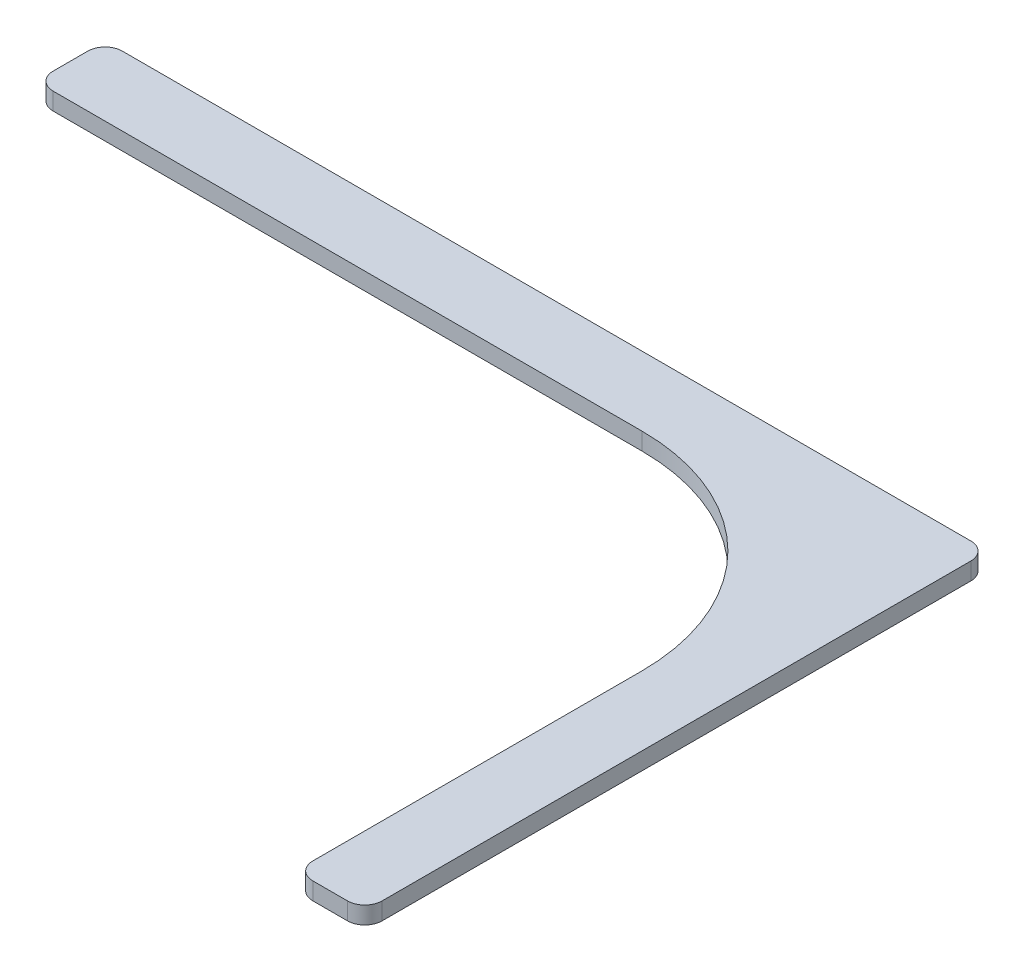
ISO-10303-21;
HEADER;
FILE_DESCRIPTION(('STEP AP214'),'2;1');
FILE_NAME('part.step','',(''),(''),'','','');
FILE_SCHEMA(('AUTOMOTIVE_DESIGN { 1 0 10303 214 1 1 1 1 }'));
ENDSEC;
DATA;
#1=APPLICATION_CONTEXT('core data for automotive mechanical design processes');
#2=APPLICATION_PROTOCOL_DEFINITION('international standard','automotive_design',2000,#1);
#3=PRODUCT_CONTEXT('',#1,'mechanical');
#4=PRODUCT('Part','Part','',(#3));
#5=PRODUCT_RELATED_PRODUCT_CATEGORY('part','',(#4));
#6=PRODUCT_DEFINITION_FORMATION('','',#4);
#7=PRODUCT_DEFINITION_CONTEXT('part definition',#1,'design');
#8=PRODUCT_DEFINITION('design','',#6,#7);
#9=PRODUCT_DEFINITION_SHAPE('','',#8);
#10=(LENGTH_UNIT() NAMED_UNIT(*) SI_UNIT(.MILLI.,.METRE.));
#11=(NAMED_UNIT(*) PLANE_ANGLE_UNIT() SI_UNIT($,.RADIAN.));
#12=(NAMED_UNIT(*) SI_UNIT($,.STERADIAN.) SOLID_ANGLE_UNIT());
#13=UNCERTAINTY_MEASURE_WITH_UNIT(LENGTH_MEASURE(1.E-05),#10,'distance_accuracy_value','');
#14=(GEOMETRIC_REPRESENTATION_CONTEXT(3) GLOBAL_UNCERTAINTY_ASSIGNED_CONTEXT((#13)) GLOBAL_UNIT_ASSIGNED_CONTEXT((#10,
#11,#12)) REPRESENTATION_CONTEXT('',''));
#15=CARTESIAN_POINT('',(0.,0.,0.));
#16=DIRECTION('',(0.,0.,1.));
#17=DIRECTION('',(1.,0.,0.));
#18=AXIS2_PLACEMENT_3D('',#15,#16,#17);
#19=CARTESIAN_POINT('',(-25.4,6.35,0.));
#20=DIRECTION('',(0.,0.,-1.));
#21=DIRECTION('',(-1.,0.,0.));
#22=AXIS2_PLACEMENT_3D('',#19,#20,#21);
#23=PLANE('',#22);
#24=DIRECTION('',(1.,0.,0.));
#25=VECTOR('',#24,1.);
#26=CARTESIAN_POINT('',(-25.4,6.35,0.));
#27=LINE('',#26,#25);
#28=CARTESIAN_POINT('',(-19.05,6.35,0.));
#29=VERTEX_POINT('',#28);
#30=CARTESIAN_POINT('',(-6.35,6.35,0.));
#31=VERTEX_POINT('',#30);
#32=EDGE_CURVE('E139',#29,#31,#27,.T.);
#33=ORIENTED_EDGE('',*,*,#32,.F.);
#34=DIRECTION('',(0.,-1.,0.));
#35=VECTOR('',#34,1.);
#36=CARTESIAN_POINT('',(-19.05,6.35,0.));
#37=LINE('',#36,#35);
#38=CARTESIAN_POINT('',(-19.05,0.,0.));
#39=VERTEX_POINT('',#38);
#40=EDGE_CURVE('E127',#29,#39,#37,.T.);
#41=ORIENTED_EDGE('',*,*,#40,.T.);
#42=DIRECTION('',(1.,0.,0.));
#43=VECTOR('',#42,1.);
#44=CARTESIAN_POINT('',(-25.4,0.,0.));
#45=LINE('',#44,#43);
#46=CARTESIAN_POINT('',(-6.35,0.,0.));
#47=VERTEX_POINT('',#46);
#48=EDGE_CURVE('E136',#39,#47,#45,.T.);
#49=ORIENTED_EDGE('',*,*,#48,.T.);
#50=DIRECTION('',(0.,-1.,0.));
#51=VECTOR('',#50,1.);
#52=CARTESIAN_POINT('',(-6.35,6.35,0.));
#53=LINE('',#52,#51);
#54=EDGE_CURVE('E141',#47,#31,#53,.F.);
#55=ORIENTED_EDGE('',*,*,#54,.T.);
#56=EDGE_LOOP('',(#33,#41,#49,#55));
#57=FACE_BOUND('',#56,.T.);
#58=ADVANCED_FACE('F33',(#57),#23,.F.);
#59=CARTESIAN_POINT('',(0.,6.35,0.));
#60=DIRECTION('',(-1.,0.,0.));
#61=DIRECTION('',(0.,0.,1.));
#62=AXIS2_PLACEMENT_3D('',#59,#60,#61);
#63=PLANE('',#62);
#64=DIRECTION('',(0.,0.,-1.));
#65=VECTOR('',#64,1.);
#66=CARTESIAN_POINT('',(0.,6.35,0.));
#67=LINE('',#66,#65);
#68=CARTESIAN_POINT('',(0.,6.35,-6.35));
#69=VERTEX_POINT('',#68);
#70=CARTESIAN_POINT('',(0.,6.35,-222.25));
#71=VERTEX_POINT('',#70);
#72=EDGE_CURVE('E220',#69,#71,#67,.T.);
#73=ORIENTED_EDGE('',*,*,#72,.F.);
#74=DIRECTION('',(0.,-1.,0.));
#75=VECTOR('',#74,1.);
#76=CARTESIAN_POINT('',(0.,6.35,-6.35));
#77=LINE('',#76,#75);
#78=CARTESIAN_POINT('',(0.,0.,-6.35));
#79=VERTEX_POINT('',#78);
#80=EDGE_CURVE('E196',#69,#79,#77,.T.);
#81=ORIENTED_EDGE('',*,*,#80,.T.);
#82=DIRECTION('',(0.,0.,-1.));
#83=VECTOR('',#82,1.);
#84=CARTESIAN_POINT('',(0.,0.,0.));
#85=LINE('',#84,#83);
#86=CARTESIAN_POINT('',(0.,0.,-222.25));
#87=VERTEX_POINT('',#86);
#88=EDGE_CURVE('E146',#79,#87,#85,.T.);
#89=ORIENTED_EDGE('',*,*,#88,.T.);
#90=DIRECTION('',(0.,-1.,0.));
#91=VECTOR('',#90,1.);
#92=CARTESIAN_POINT('',(0.,6.35,-222.25));
#93=LINE('',#92,#91);
#94=EDGE_CURVE('E194',#87,#71,#93,.F.);
#95=ORIENTED_EDGE('',*,*,#94,.T.);
#96=EDGE_LOOP('',(#73,#81,#89,#95));
#97=FACE_BOUND('',#96,.T.);
#98=ADVANCED_FACE('F229',(#97),#63,.F.);
#99=CARTESIAN_POINT('',(0.,6.35,-228.6));
#100=DIRECTION('',(0.,0.,1.));
#101=DIRECTION('',(1.,0.,0.));
#102=AXIS2_PLACEMENT_3D('',#99,#100,#101);
#103=PLANE('',#102);
#104=DIRECTION('',(-1.,0.,0.));
#105=VECTOR('',#104,1.);
#106=CARTESIAN_POINT('',(0.,0.,-228.6));
#107=LINE('',#106,#105);
#108=CARTESIAN_POINT('',(-6.35,0.,-228.6));
#109=VERTEX_POINT('',#108);
#110=CARTESIAN_POINT('',(-317.5,0.,-228.6));
#111=VERTEX_POINT('',#110);
#112=EDGE_CURVE('E149',#109,#111,#107,.T.);
#113=ORIENTED_EDGE('',*,*,#112,.T.);
#114=DIRECTION('',(0.,-1.,0.));
#115=VECTOR('',#114,1.);
#116=CARTESIAN_POINT('',(-317.5,6.35,-228.6));
#117=LINE('',#116,#115);
#118=CARTESIAN_POINT('',(-317.5,6.35,-228.6));
#119=VERTEX_POINT('',#118);
#120=EDGE_CURVE('E189',#111,#119,#117,.F.);
#121=ORIENTED_EDGE('',*,*,#120,.T.);
#122=DIRECTION('',(-1.,0.,0.));
#123=VECTOR('',#122,1.);
#124=CARTESIAN_POINT('',(0.,6.35,-228.6));
#125=LINE('',#124,#123);
#126=CARTESIAN_POINT('',(-6.35,6.35,-228.6));
#127=VERTEX_POINT('',#126);
#128=EDGE_CURVE('E215',#127,#119,#125,.T.);
#129=ORIENTED_EDGE('',*,*,#128,.F.);
#130=DIRECTION('',(0.,-1.,0.));
#131=VECTOR('',#130,1.);
#132=CARTESIAN_POINT('',(-6.35,6.35,-228.6));
#133=LINE('',#132,#131);
#134=EDGE_CURVE('E186',#127,#109,#133,.T.);
#135=ORIENTED_EDGE('',*,*,#134,.T.);
#136=EDGE_LOOP('',(#113,#121,#129,#135));
#137=FACE_BOUND('',#136,.T.);
#138=ADVANCED_FACE('F238',(#137),#103,.F.);
#139=CARTESIAN_POINT('',(-323.85,6.35,-228.6));
#140=DIRECTION('',(1.,0.,0.));
#141=DIRECTION('',(0.,0.,-1.));
#142=AXIS2_PLACEMENT_3D('',#139,#140,#141);
#143=PLANE('',#142);
#144=DIRECTION('',(0.,0.,1.));
#145=VECTOR('',#144,1.);
#146=CARTESIAN_POINT('',(-323.85,6.35,-228.6));
#147=LINE('',#146,#145);
#148=CARTESIAN_POINT('',(-323.85,6.35,-222.25));
#149=VERTEX_POINT('',#148);
#150=CARTESIAN_POINT('',(-323.85,6.35,-209.55));
#151=VERTEX_POINT('',#150);
#152=EDGE_CURVE('E214',#149,#151,#147,.T.);
#153=ORIENTED_EDGE('',*,*,#152,.F.);
#154=DIRECTION('',(0.,-1.,0.));
#155=VECTOR('',#154,1.);
#156=CARTESIAN_POINT('',(-323.85,6.35,-222.25));
#157=LINE('',#156,#155);
#158=CARTESIAN_POINT('',(-323.85,0.,-222.25));
#159=VERTEX_POINT('',#158);
#160=EDGE_CURVE('E183',#149,#159,#157,.T.);
#161=ORIENTED_EDGE('',*,*,#160,.T.);
#162=DIRECTION('',(0.,0.,1.));
#163=VECTOR('',#162,1.);
#164=CARTESIAN_POINT('',(-323.85,0.,-228.6));
#165=LINE('',#164,#163);
#166=CARTESIAN_POINT('',(-323.85,0.,-209.55));
#167=VERTEX_POINT('',#166);
#168=EDGE_CURVE('E157',#159,#167,#165,.T.);
#169=ORIENTED_EDGE('',*,*,#168,.T.);
#170=DIRECTION('',(0.,-1.,0.));
#171=VECTOR('',#170,1.);
#172=CARTESIAN_POINT('',(-323.85,6.35,-209.55));
#173=LINE('',#172,#171);
#174=EDGE_CURVE('E181',#167,#151,#173,.F.);
#175=ORIENTED_EDGE('',*,*,#174,.T.);
#176=EDGE_LOOP('',(#153,#161,#169,#175));
#177=FACE_BOUND('',#176,.T.);
#178=ADVANCED_FACE('F247',(#177),#143,.F.);
#179=CARTESIAN_POINT('',(-323.85,6.35,-203.2));
#180=DIRECTION('',(0.,0.,-1.));
#181=DIRECTION('',(-1.,0.,0.));
#182=AXIS2_PLACEMENT_3D('',#179,#180,#181);
#183=PLANE('',#182);
#184=DIRECTION('',(1.,0.,0.));
#185=VECTOR('',#184,1.);
#186=CARTESIAN_POINT('',(-323.85,0.,-203.2));
#187=LINE('',#186,#185);
#188=CARTESIAN_POINT('',(-317.5,0.,-203.2));
#189=VERTEX_POINT('',#188);
#190=CARTESIAN_POINT('',(-101.6,0.,-203.2));
#191=VERTEX_POINT('',#190);
#192=EDGE_CURVE('E160',#189,#191,#187,.T.);
#193=ORIENTED_EDGE('',*,*,#192,.T.);
#194=DIRECTION('',(0.,-1.,0.));
#195=VECTOR('',#194,1.);
#196=CARTESIAN_POINT('',(-101.6,6.35,-203.2));
#197=LINE('',#196,#195);
#198=CARTESIAN_POINT('',(-101.6,6.35,-203.2));
#199=VERTEX_POINT('',#198);
#200=EDGE_CURVE('E54',#191,#199,#197,.F.);
#201=ORIENTED_EDGE('',*,*,#200,.T.);
#202=DIRECTION('',(1.,0.,0.));
#203=VECTOR('',#202,1.);
#204=CARTESIAN_POINT('',(-323.85,6.35,-203.2));
#205=LINE('',#204,#203);
#206=CARTESIAN_POINT('',(-317.5,6.35,-203.2));
#207=VERTEX_POINT('',#206);
#208=EDGE_CURVE('E210',#207,#199,#205,.T.);
#209=ORIENTED_EDGE('',*,*,#208,.F.);
#210=DIRECTION('',(0.,-1.,0.));
#211=VECTOR('',#210,1.);
#212=CARTESIAN_POINT('',(-317.5,6.35,-203.2));
#213=LINE('',#212,#211);
#214=EDGE_CURVE('E191',#207,#189,#213,.T.);
#215=ORIENTED_EDGE('',*,*,#214,.T.);
#216=EDGE_LOOP('',(#193,#201,#209,#215));
#217=FACE_BOUND('',#216,.T.);
#218=ADVANCED_FACE('F251',(#217),#183,.F.);
#219=CARTESIAN_POINT('',(-25.4,6.35,0.));
#220=DIRECTION('',(1.,0.,0.));
#221=DIRECTION('',(0.,0.,-1.));
#222=AXIS2_PLACEMENT_3D('',#219,#220,#221);
#223=PLANE('',#222);
#224=DIRECTION('',(0.,0.,1.));
#225=VECTOR('',#224,1.);
#226=CARTESIAN_POINT('',(-25.4,6.35,0.));
#227=LINE('',#226,#225);
#228=CARTESIAN_POINT('',(-25.4,6.35,-127.));
#229=VERTEX_POINT('',#228);
#230=CARTESIAN_POINT('',(-25.4,6.35,-6.35));
#231=VERTEX_POINT('',#230);
#232=EDGE_CURVE('E152',#229,#231,#227,.T.);
#233=ORIENTED_EDGE('',*,*,#232,.F.);
#234=DIRECTION('',(0.,-1.,0.));
#235=VECTOR('',#234,1.);
#236=CARTESIAN_POINT('',(-25.4,0.,-127.));
#237=LINE('',#236,#235);
#238=CARTESIAN_POINT('',(-25.4,0.,-127.));
#239=VERTEX_POINT('',#238);
#240=EDGE_CURVE('E199',#229,#239,#237,.T.);
#241=ORIENTED_EDGE('',*,*,#240,.T.);
#242=DIRECTION('',(0.,0.,1.));
#243=VECTOR('',#242,1.);
#244=CARTESIAN_POINT('',(-25.4,0.,0.));
#245=LINE('',#244,#243);
#246=CARTESIAN_POINT('',(-25.4,0.,-6.35));
#247=VERTEX_POINT('',#246);
#248=EDGE_CURVE('E162',#239,#247,#245,.T.);
#249=ORIENTED_EDGE('',*,*,#248,.T.);
#250=DIRECTION('',(0.,-1.,0.));
#251=VECTOR('',#250,1.);
#252=CARTESIAN_POINT('',(-25.4,6.35,-6.35));
#253=LINE('',#252,#251);
#254=EDGE_CURVE('E129',#247,#231,#253,.F.);
#255=ORIENTED_EDGE('',*,*,#254,.T.);
#256=EDGE_LOOP('',(#233,#241,#249,#255));
#257=FACE_BOUND('',#256,.T.);
#258=ADVANCED_FACE('F205',(#257),#223,.F.);
#259=CARTESIAN_POINT('',(0.,6.35,0.));
#260=DIRECTION('',(0.,1.,0.));
#261=DIRECTION('',(0.,0.,1.));
#262=AXIS2_PLACEMENT_3D('',#259,#260,#261);
#263=PLANE('',#262);
#264=ORIENTED_EDGE('',*,*,#208,.T.);
#265=CARTESIAN_POINT('',(-101.6,6.35,-127.));
#266=DIRECTION('',(0.,1.,0.));
#267=DIRECTION('',(0.,0.,1.));
#268=AXIS2_PLACEMENT_3D('',#265,#266,#267);
#269=CIRCLE('',#268,76.2);
#270=EDGE_CURVE('E11',#199,#229,#269,.F.);
#271=ORIENTED_EDGE('',*,*,#270,.T.);
#272=ORIENTED_EDGE('',*,*,#232,.T.);
#273=CARTESIAN_POINT('',(-19.05,6.35,-6.35));
#274=DIRECTION('',(0.,1.,0.));
#275=DIRECTION('',(0.,0.,1.));
#276=AXIS2_PLACEMENT_3D('',#273,#274,#275);
#277=CIRCLE('',#276,6.35);
#278=EDGE_CURVE('E179',#231,#29,#277,.T.);
#279=ORIENTED_EDGE('',*,*,#278,.T.);
#280=ORIENTED_EDGE('',*,*,#32,.T.);
#281=CARTESIAN_POINT('',(-6.35,6.35,-6.35));
#282=DIRECTION('',(0.,1.,0.));
#283=DIRECTION('',(0.,0.,1.));
#284=AXIS2_PLACEMENT_3D('',#281,#282,#283);
#285=CIRCLE('',#284,6.35);
#286=EDGE_CURVE('E173',#31,#69,#285,.T.);
#287=ORIENTED_EDGE('',*,*,#286,.T.);
#288=ORIENTED_EDGE('',*,*,#72,.T.);
#289=CARTESIAN_POINT('',(-6.35,6.35,-222.25));
#290=DIRECTION('',(0.,1.,0.));
#291=DIRECTION('',(0.,0.,1.));
#292=AXIS2_PLACEMENT_3D('',#289,#290,#291);
#293=CIRCLE('',#292,6.35);
#294=EDGE_CURVE('E171',#71,#127,#293,.T.);
#295=ORIENTED_EDGE('',*,*,#294,.T.);
#296=ORIENTED_EDGE('',*,*,#128,.T.);
#297=CARTESIAN_POINT('',(-317.5,6.35,-222.25));
#298=DIRECTION('',(0.,1.,0.));
#299=DIRECTION('',(0.,0.,1.));
#300=AXIS2_PLACEMENT_3D('',#297,#298,#299);
#301=CIRCLE('',#300,6.35);
#302=EDGE_CURVE('E177',#119,#149,#301,.T.);
#303=ORIENTED_EDGE('',*,*,#302,.T.);
#304=ORIENTED_EDGE('',*,*,#152,.T.);
#305=CARTESIAN_POINT('',(-317.5,6.35,-209.55));
#306=DIRECTION('',(0.,1.,0.));
#307=DIRECTION('',(0.,0.,1.));
#308=AXIS2_PLACEMENT_3D('',#305,#306,#307);
#309=CIRCLE('',#308,6.35);
#310=EDGE_CURVE('E175',#151,#207,#309,.T.);
#311=ORIENTED_EDGE('',*,*,#310,.T.);
#312=EDGE_LOOP('',(#264,#271,#272,#279,#280,#287,#288,#295,#296,#303,#304,#311));
#313=FACE_BOUND('',#312,.T.);
#314=ADVANCED_FACE('F209',(#313),#263,.T.);
#315=CARTESIAN_POINT('',(0.,0.,0.));
#316=DIRECTION('',(0.,1.,0.));
#317=DIRECTION('',(0.,0.,1.));
#318=AXIS2_PLACEMENT_3D('',#315,#316,#317);
#319=PLANE('',#318);
#320=ORIENTED_EDGE('',*,*,#48,.F.);
#321=CARTESIAN_POINT('',(-19.05,0.,-6.35));
#322=DIRECTION('',(0.,1.,0.));
#323=DIRECTION('',(0.,0.,1.));
#324=AXIS2_PLACEMENT_3D('',#321,#322,#323);
#325=CIRCLE('',#324,6.35);
#326=EDGE_CURVE('E123',#39,#247,#325,.F.);
#327=ORIENTED_EDGE('',*,*,#326,.T.);
#328=ORIENTED_EDGE('',*,*,#248,.F.);
#329=CARTESIAN_POINT('',(-101.6,0.,-127.));
#330=DIRECTION('',(0.,1.,0.));
#331=DIRECTION('',(0.,0.,1.));
#332=AXIS2_PLACEMENT_3D('',#329,#330,#331);
#333=CIRCLE('',#332,76.2);
#334=EDGE_CURVE('E41',#239,#191,#333,.T.);
#335=ORIENTED_EDGE('',*,*,#334,.T.);
#336=ORIENTED_EDGE('',*,*,#192,.F.);
#337=CARTESIAN_POINT('',(-317.5,0.,-209.55));
#338=DIRECTION('',(0.,1.,0.));
#339=DIRECTION('',(0.,0.,1.));
#340=AXIS2_PLACEMENT_3D('',#337,#338,#339);
#341=CIRCLE('',#340,6.35);
#342=EDGE_CURVE('E167',#189,#167,#341,.F.);
#343=ORIENTED_EDGE('',*,*,#342,.T.);
#344=ORIENTED_EDGE('',*,*,#168,.F.);
#345=CARTESIAN_POINT('',(-317.5,0.,-222.25));
#346=DIRECTION('',(0.,1.,0.));
#347=DIRECTION('',(0.,0.,1.));
#348=AXIS2_PLACEMENT_3D('',#345,#346,#347);
#349=CIRCLE('',#348,6.35);
#350=EDGE_CURVE('E131',#159,#111,#349,.F.);
#351=ORIENTED_EDGE('',*,*,#350,.T.);
#352=ORIENTED_EDGE('',*,*,#112,.F.);
#353=CARTESIAN_POINT('',(-6.35,0.,-222.25));
#354=DIRECTION('',(0.,1.,0.));
#355=DIRECTION('',(0.,0.,1.));
#356=AXIS2_PLACEMENT_3D('',#353,#354,#355);
#357=CIRCLE('',#356,6.35);
#358=EDGE_CURVE('E140',#109,#87,#357,.F.);
#359=ORIENTED_EDGE('',*,*,#358,.T.);
#360=ORIENTED_EDGE('',*,*,#88,.F.);
#361=CARTESIAN_POINT('',(-6.35,0.,-6.35));
#362=DIRECTION('',(0.,1.,0.));
#363=DIRECTION('',(0.,0.,1.));
#364=AXIS2_PLACEMENT_3D('',#361,#362,#363);
#365=CIRCLE('',#364,6.35);
#366=EDGE_CURVE('E145',#79,#47,#365,.F.);
#367=ORIENTED_EDGE('',*,*,#366,.T.);
#368=EDGE_LOOP('',(#320,#327,#328,#335,#336,#343,#344,#351,#352,#359,#360,#367));
#369=FACE_BOUND('',#368,.T.);
#370=ADVANCED_FACE('F143',(#369),#319,.F.);
#371=CARTESIAN_POINT('',(-19.05,6.35,-6.35));
#372=DIRECTION('',(0.,-1.,0.));
#373=DIRECTION('',(0.,0.,-1.));
#374=AXIS2_PLACEMENT_3D('',#371,#372,#373);
#375=CYLINDRICAL_SURFACE('',#374,6.35);
#376=ORIENTED_EDGE('',*,*,#278,.F.);
#377=ORIENTED_EDGE('',*,*,#254,.F.);
#378=ORIENTED_EDGE('',*,*,#326,.F.);
#379=ORIENTED_EDGE('',*,*,#40,.F.);
#380=EDGE_LOOP('',(#376,#377,#378,#379));
#381=FACE_BOUND('',#380,.T.);
#382=ADVANCED_FACE('F126',(#381),#375,.T.);
#383=CARTESIAN_POINT('',(-317.5,6.35,-222.25));
#384=DIRECTION('',(0.,-1.,0.));
#385=DIRECTION('',(0.,0.,-1.));
#386=AXIS2_PLACEMENT_3D('',#383,#384,#385);
#387=CYLINDRICAL_SURFACE('',#386,6.35);
#388=ORIENTED_EDGE('',*,*,#302,.F.);
#389=ORIENTED_EDGE('',*,*,#120,.F.);
#390=ORIENTED_EDGE('',*,*,#350,.F.);
#391=ORIENTED_EDGE('',*,*,#160,.F.);
#392=EDGE_LOOP('',(#388,#389,#390,#391));
#393=FACE_BOUND('',#392,.T.);
#394=ADVANCED_FACE('F244',(#393),#387,.T.);
#395=CARTESIAN_POINT('',(-317.5,6.35,-209.55));
#396=DIRECTION('',(0.,-1.,0.));
#397=DIRECTION('',(0.,0.,-1.));
#398=AXIS2_PLACEMENT_3D('',#395,#396,#397);
#399=CYLINDRICAL_SURFACE('',#398,6.35);
#400=ORIENTED_EDGE('',*,*,#310,.F.);
#401=ORIENTED_EDGE('',*,*,#174,.F.);
#402=ORIENTED_EDGE('',*,*,#342,.F.);
#403=ORIENTED_EDGE('',*,*,#214,.F.);
#404=EDGE_LOOP('',(#400,#401,#402,#403));
#405=FACE_BOUND('',#404,.T.);
#406=ADVANCED_FACE('F250',(#405),#399,.T.);
#407=CARTESIAN_POINT('',(-6.35,6.35,-6.35));
#408=DIRECTION('',(0.,-1.,0.));
#409=DIRECTION('',(0.,0.,-1.));
#410=AXIS2_PLACEMENT_3D('',#407,#408,#409);
#411=CYLINDRICAL_SURFACE('',#410,6.35);
#412=ORIENTED_EDGE('',*,*,#286,.F.);
#413=ORIENTED_EDGE('',*,*,#54,.F.);
#414=ORIENTED_EDGE('',*,*,#366,.F.);
#415=ORIENTED_EDGE('',*,*,#80,.F.);
#416=EDGE_LOOP('',(#412,#413,#414,#415));
#417=FACE_BOUND('',#416,.T.);
#418=ADVANCED_FACE('F227',(#417),#411,.T.);
#419=CARTESIAN_POINT('',(-6.35,6.35,-222.25));
#420=DIRECTION('',(0.,-1.,0.));
#421=DIRECTION('',(0.,0.,-1.));
#422=AXIS2_PLACEMENT_3D('',#419,#420,#421);
#423=CYLINDRICAL_SURFACE('',#422,6.35);
#424=ORIENTED_EDGE('',*,*,#294,.F.);
#425=ORIENTED_EDGE('',*,*,#94,.F.);
#426=ORIENTED_EDGE('',*,*,#358,.F.);
#427=ORIENTED_EDGE('',*,*,#134,.F.);
#428=EDGE_LOOP('',(#424,#425,#426,#427));
#429=FACE_BOUND('',#428,.T.);
#430=ADVANCED_FACE('F235',(#429),#423,.T.);
#431=CARTESIAN_POINT('',(-101.6,6.35,-127.));
#432=DIRECTION('',(0.,1.,0.));
#433=DIRECTION('',(0.,0.,1.));
#434=AXIS2_PLACEMENT_3D('',#431,#432,#433);
#435=CYLINDRICAL_SURFACE('',#434,76.2);
#436=ORIENTED_EDGE('',*,*,#270,.F.);
#437=ORIENTED_EDGE('',*,*,#200,.F.);
#438=ORIENTED_EDGE('',*,*,#334,.F.);
#439=ORIENTED_EDGE('',*,*,#240,.F.);
#440=EDGE_LOOP('',(#436,#437,#438,#439));
#441=FACE_BOUND('',#440,.T.);
#442=ADVANCED_FACE('F35',(#441),#435,.F.);
#443=CLOSED_SHELL('',(#58,#98,#138,#178,#218,#258,#314,#370,#382,#394,#406,#418,#430,#442));
#444=MANIFOLD_SOLID_BREP('B2',#443);
#445=ADVANCED_BREP_SHAPE_REPRESENTATION('',(#18,#444),#14);
#446=SHAPE_DEFINITION_REPRESENTATION(#9,#445);
ENDSEC;
END-ISO-10303-21;
